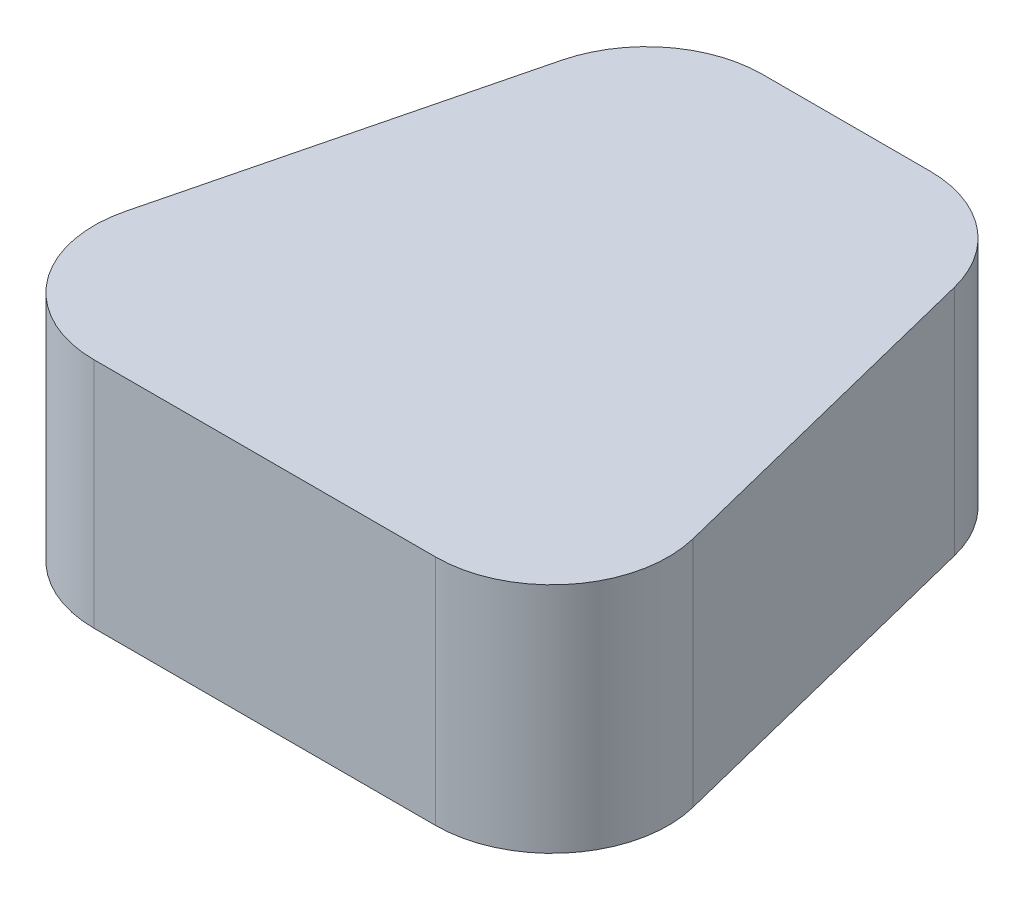
ISO-10303-21;
HEADER;
FILE_DESCRIPTION(('STEP AP214'),'2;1');
FILE_NAME('part.step','',(''),(''),'','','');
FILE_SCHEMA(('AUTOMOTIVE_DESIGN { 1 0 10303 214 1 1 1 1 }'));
ENDSEC;
DATA;
#1=APPLICATION_CONTEXT('core data for automotive mechanical design processes');
#2=APPLICATION_PROTOCOL_DEFINITION('international standard','automotive_design',2000,#1);
#3=PRODUCT_CONTEXT('',#1,'mechanical');
#4=PRODUCT('Part','Part','',(#3));
#5=PRODUCT_RELATED_PRODUCT_CATEGORY('part','',(#4));
#6=PRODUCT_DEFINITION_FORMATION('','',#4);
#7=PRODUCT_DEFINITION_CONTEXT('part definition',#1,'design');
#8=PRODUCT_DEFINITION('design','',#6,#7);
#9=PRODUCT_DEFINITION_SHAPE('','',#8);
#10=(LENGTH_UNIT() NAMED_UNIT(*) SI_UNIT(.MILLI.,.METRE.));
#11=(NAMED_UNIT(*) PLANE_ANGLE_UNIT() SI_UNIT($,.RADIAN.));
#12=(NAMED_UNIT(*) SI_UNIT($,.STERADIAN.) SOLID_ANGLE_UNIT());
#13=UNCERTAINTY_MEASURE_WITH_UNIT(LENGTH_MEASURE(1.E-05),#10,'distance_accuracy_value','');
#14=(GEOMETRIC_REPRESENTATION_CONTEXT(3) GLOBAL_UNCERTAINTY_ASSIGNED_CONTEXT((#13)) GLOBAL_UNIT_ASSIGNED_CONTEXT((#10,
#11,#12)) REPRESENTATION_CONTEXT('',''));
#15=CARTESIAN_POINT('',(0.,0.,0.));
#16=DIRECTION('',(0.,0.,1.));
#17=DIRECTION('',(1.,0.,0.));
#18=AXIS2_PLACEMENT_3D('',#15,#16,#17);
#19=CARTESIAN_POINT('',(0.,1.,0.));
#20=DIRECTION('',(0.,-1.,0.));
#21=DIRECTION('',(0.,0.,-1.));
#22=AXIS2_PLACEMENT_3D('',#19,#20,#21);
#23=PLANE('',#22);
#24=CARTESIAN_POINT('',(-6.84160068989698,0.999999999999994,3.95000000000001));
#25=DIRECTION('',(0.,1.,0.));
#26=DIRECTION('',(0.,0.,1.));
#27=AXIS2_PLACEMENT_3D('',#24,#25,#26);
#28=CIRCLE('',#27,5.);
#29=CARTESIAN_POINT('',(-6.84160068989698,0.999999999999994,8.95000000000001));
#30=VERTEX_POINT('',#29);
#31=EDGE_CURVE('E194',#30,#30,#28,.T.);
#32=ORIENTED_EDGE('',*,*,#31,.T.);
#33=EDGE_LOOP('',(#32));
#34=FACE_BOUND('',#33,.T.);
#35=DIRECTION('',(-0.242535625036333,0.,0.970142500145332));
#36=VECTOR('',#35,1.);
#37=CARTESIAN_POINT('',(-27.4999999999999,0.999999999999994,25.));
#38=LINE('',#37,#36);
#39=CARTESIAN_POINT('',(-16.8936609374091,0.999999999999997,-17.4253562503633));
#40=VERTEX_POINT('',#39);
#41=CARTESIAN_POINT('',(-24.3936609374091,0.999999999999997,12.5746437496367));
#42=VERTEX_POINT('',#41);
#43=EDGE_CURVE('E129',#40,#42,#38,.T.);
#44=ORIENTED_EDGE('',*,*,#43,.F.);
#45=CARTESIAN_POINT('',(-7.1922359359558,1.,-15.));
#46=DIRECTION('',(0.,-1.,0.));
#47=DIRECTION('',(0.,0.,-1.));
#48=AXIS2_PLACEMENT_3D('',#45,#46,#47);
#49=CIRCLE('',#48,10.);
#50=CARTESIAN_POINT('',(-7.19223593595586,1.,-25.));
#51=VERTEX_POINT('',#50);
#52=EDGE_CURVE('E112',#40,#51,#49,.T.);
#53=ORIENTED_EDGE('',*,*,#52,.T.);
#54=DIRECTION('',(-1.,0.,0.));
#55=VECTOR('',#54,1.);
#56=CARTESIAN_POINT('',(-15.,1.,-25.));
#57=LINE('',#56,#55);
#58=CARTESIAN_POINT('',(7.19223593595592,1.,-25.));
#59=VERTEX_POINT('',#58);
#60=EDGE_CURVE('E152',#59,#51,#57,.T.);
#61=ORIENTED_EDGE('',*,*,#60,.F.);
#62=CARTESIAN_POINT('',(7.19223593595586,1.,-15.));
#63=DIRECTION('',(0.,-1.,0.));
#64=DIRECTION('',(0.,0.,-1.));
#65=AXIS2_PLACEMENT_3D('',#62,#63,#64);
#66=CIRCLE('',#65,10.);
#67=CARTESIAN_POINT('',(16.8936609374092,1.,-17.4253562503633));
#68=VERTEX_POINT('',#67);
#69=EDGE_CURVE('E123',#59,#68,#66,.T.);
#70=ORIENTED_EDGE('',*,*,#69,.T.);
#71=DIRECTION('',(-0.242535625036333,0.,-0.970142500145332));
#72=VECTOR('',#71,1.);
#73=CARTESIAN_POINT('',(15.,1.,-25.));
#74=LINE('',#73,#72);
#75=CARTESIAN_POINT('',(24.3936609374092,1.,12.5746437496366));
#76=VERTEX_POINT('',#75);
#77=EDGE_CURVE('E142',#76,#68,#74,.T.);
#78=ORIENTED_EDGE('',*,*,#77,.F.);
#79=CARTESIAN_POINT('',(14.6922359359559,1.,15.));
#80=DIRECTION('',(0.,-1.,0.));
#81=DIRECTION('',(0.,0.,-1.));
#82=AXIS2_PLACEMENT_3D('',#79,#80,#81);
#83=CIRCLE('',#82,10.);
#84=CARTESIAN_POINT('',(14.692235935956,0.999999999999994,25.));
#85=VERTEX_POINT('',#84);
#86=EDGE_CURVE('E156',#76,#85,#83,.T.);
#87=ORIENTED_EDGE('',*,*,#86,.T.);
#88=DIRECTION('',(1.,0.,0.));
#89=VECTOR('',#88,1.);
#90=CARTESIAN_POINT('',(27.5,1.,25.));
#91=LINE('',#90,#89);
#92=CARTESIAN_POINT('',(-14.6922359359558,1.,25.));
#93=VERTEX_POINT('',#92);
#94=EDGE_CURVE('E138',#93,#85,#91,.T.);
#95=ORIENTED_EDGE('',*,*,#94,.F.);
#96=CARTESIAN_POINT('',(-14.6922359359559,0.999999999999994,15.));
#97=DIRECTION('',(0.,-1.,0.));
#98=DIRECTION('',(0.,0.,-1.));
#99=AXIS2_PLACEMENT_3D('',#96,#97,#98);
#100=CIRCLE('',#99,10.);
#101=EDGE_CURVE('E133',#93,#42,#100,.T.);
#102=ORIENTED_EDGE('',*,*,#101,.T.);
#103=EDGE_LOOP('',(#44,#53,#61,#70,#78,#87,#95,#102));
#104=FACE_BOUND('',#103,.T.);
#105=CARTESIAN_POINT('',(6.84160068989709,1.,3.95000000000006));
#106=DIRECTION('',(0.,1.,0.));
#107=DIRECTION('',(0.,0.,1.));
#108=AXIS2_PLACEMENT_3D('',#105,#106,#107);
#109=CIRCLE('',#108,5.);
#110=CARTESIAN_POINT('',(6.84160068989709,1.,8.95000000000006));
#111=VERTEX_POINT('',#110);
#112=EDGE_CURVE('E139',#111,#111,#109,.T.);
#113=ORIENTED_EDGE('',*,*,#112,.T.);
#114=EDGE_LOOP('',(#113));
#115=FACE_BOUND('',#114,.T.);
#116=CARTESIAN_POINT('',(0.,1.,-10.3));
#117=DIRECTION('',(0.,1.,0.));
#118=DIRECTION('',(0.,0.,1.));
#119=AXIS2_PLACEMENT_3D('',#116,#117,#118);
#120=CIRCLE('',#119,5.);
#121=CARTESIAN_POINT('',(0.,1.,-5.29999999999998));
#122=VERTEX_POINT('',#121);
#123=EDGE_CURVE('E200',#122,#122,#120,.T.);
#124=ORIENTED_EDGE('',*,*,#123,.T.);
#125=EDGE_LOOP('',(#124));
#126=FACE_BOUND('',#125,.T.);
#127=ADVANCED_FACE('F46',(#34,#104,#115,#126),#23,.T.);
#128=CARTESIAN_POINT('',(-27.4999999999999,21.,25.));
#129=DIRECTION('',(0.970142500145332,0.,0.242535625036333));
#130=DIRECTION('',(0.242535625036333,0.,-0.970142500145332));
#131=AXIS2_PLACEMENT_3D('',#128,#129,#130);
#132=PLANE('',#131);
#133=DIRECTION('',(-0.242535625036333,0.,0.970142500145332));
#134=VECTOR('',#133,1.);
#135=CARTESIAN_POINT('',(-27.4999999999999,21.,25.));
#136=LINE('',#135,#134);
#137=CARTESIAN_POINT('',(-16.8936609374091,21.,-17.4253562503633));
#138=VERTEX_POINT('',#137);
#139=CARTESIAN_POINT('',(-24.3936609374091,21.,12.5746437496367));
#140=VERTEX_POINT('',#139);
#141=EDGE_CURVE('E132',#138,#140,#136,.T.);
#142=ORIENTED_EDGE('',*,*,#141,.F.);
#143=DIRECTION('',(0.,-1.,0.));
#144=VECTOR('',#143,1.);
#145=CARTESIAN_POINT('',(-16.8936609374091,21.,-17.4253562503633));
#146=LINE('',#145,#144);
#147=EDGE_CURVE('E116',#138,#40,#146,.T.);
#148=ORIENTED_EDGE('',*,*,#147,.T.);
#149=ORIENTED_EDGE('',*,*,#43,.T.);
#150=DIRECTION('',(0.,-1.,0.));
#151=VECTOR('',#150,1.);
#152=CARTESIAN_POINT('',(-24.3936609374091,21.,12.5746437496367));
#153=LINE('',#152,#151);
#154=EDGE_CURVE('E134',#42,#140,#153,.F.);
#155=ORIENTED_EDGE('',*,*,#154,.T.);
#156=EDGE_LOOP('',(#142,#148,#149,#155));
#157=FACE_BOUND('',#156,.T.);
#158=ADVANCED_FACE('F128',(#157),#132,.F.);
#159=CARTESIAN_POINT('',(27.5,21.,25.));
#160=DIRECTION('',(0.,0.,-1.));
#161=DIRECTION('',(-1.,0.,0.));
#162=AXIS2_PLACEMENT_3D('',#159,#160,#161);
#163=PLANE('',#162);
#164=ORIENTED_EDGE('',*,*,#94,.T.);
#165=DIRECTION('',(0.,-1.,0.));
#166=VECTOR('',#165,1.);
#167=CARTESIAN_POINT('',(14.692235935956,21.,25.));
#168=LINE('',#167,#166);
#169=CARTESIAN_POINT('',(14.692235935956,21.,25.));
#170=VERTEX_POINT('',#169);
#171=EDGE_CURVE('E13',#85,#170,#168,.F.);
#172=ORIENTED_EDGE('',*,*,#171,.T.);
#173=DIRECTION('',(1.,0.,0.));
#174=VECTOR('',#173,1.);
#175=CARTESIAN_POINT('',(27.5,21.,25.));
#176=LINE('',#175,#174);
#177=CARTESIAN_POINT('',(-14.6922359359558,21.,25.));
#178=VERTEX_POINT('',#177);
#179=EDGE_CURVE('E178',#178,#170,#176,.T.);
#180=ORIENTED_EDGE('',*,*,#179,.F.);
#181=DIRECTION('',(0.,-1.,0.));
#182=VECTOR('',#181,1.);
#183=CARTESIAN_POINT('',(-14.6922359359558,21.,25.));
#184=LINE('',#183,#182);
#185=EDGE_CURVE('E54',#178,#93,#184,.T.);
#186=ORIENTED_EDGE('',*,*,#185,.T.);
#187=EDGE_LOOP('',(#164,#172,#180,#186));
#188=FACE_BOUND('',#187,.T.);
#189=ADVANCED_FACE('F176',(#188),#163,.F.);
#190=CARTESIAN_POINT('',(15.,21.,-25.));
#191=DIRECTION('',(-0.970142500145331,0.,0.242535625036333));
#192=DIRECTION('',(0.242535625036333,0.,0.970142500145331));
#193=AXIS2_PLACEMENT_3D('',#190,#191,#192);
#194=PLANE('',#193);
#195=ORIENTED_EDGE('',*,*,#77,.T.);
#196=DIRECTION('',(0.,-1.,0.));
#197=VECTOR('',#196,1.);
#198=CARTESIAN_POINT('',(16.8936609374092,21.,-17.4253562503633));
#199=LINE('',#198,#197);
#200=CARTESIAN_POINT('',(16.8936609374092,21.,-17.4253562503633));
#201=VERTEX_POINT('',#200);
#202=EDGE_CURVE('E61',#68,#201,#199,.F.);
#203=ORIENTED_EDGE('',*,*,#202,.T.);
#204=DIRECTION('',(-0.242535625036333,0.,-0.970142500145332));
#205=VECTOR('',#204,1.);
#206=CARTESIAN_POINT('',(15.,21.,-25.));
#207=LINE('',#206,#205);
#208=CARTESIAN_POINT('',(24.3936609374092,21.,12.5746437496367));
#209=VERTEX_POINT('',#208);
#210=EDGE_CURVE('E186',#209,#201,#207,.T.);
#211=ORIENTED_EDGE('',*,*,#210,.F.);
#212=DIRECTION('',(0.,-1.,0.));
#213=VECTOR('',#212,1.);
#214=CARTESIAN_POINT('',(24.3936609374092,21.,12.5746437496367));
#215=LINE('',#214,#213);
#216=EDGE_CURVE('E169',#209,#76,#215,.T.);
#217=ORIENTED_EDGE('',*,*,#216,.T.);
#218=EDGE_LOOP('',(#195,#203,#211,#217));
#219=FACE_BOUND('',#218,.T.);
#220=ADVANCED_FACE('F185',(#219),#194,.F.);
#221=CARTESIAN_POINT('',(-15.,21.,-25.));
#222=DIRECTION('',(0.,0.,1.));
#223=DIRECTION('',(1.,0.,0.));
#224=AXIS2_PLACEMENT_3D('',#221,#222,#223);
#225=PLANE('',#224);
#226=ORIENTED_EDGE('',*,*,#60,.T.);
#227=DIRECTION('',(0.,-1.,0.));
#228=VECTOR('',#227,1.);
#229=CARTESIAN_POINT('',(-7.19223593595586,21.,-25.));
#230=LINE('',#229,#228);
#231=CARTESIAN_POINT('',(-7.19223593595586,21.,-25.));
#232=VERTEX_POINT('',#231);
#233=EDGE_CURVE('E117',#51,#232,#230,.F.);
#234=ORIENTED_EDGE('',*,*,#233,.T.);
#235=DIRECTION('',(-1.,0.,0.));
#236=VECTOR('',#235,1.);
#237=CARTESIAN_POINT('',(-15.,21.,-25.));
#238=LINE('',#237,#236);
#239=CARTESIAN_POINT('',(7.19223593595592,21.,-25.));
#240=VERTEX_POINT('',#239);
#241=EDGE_CURVE('E148',#240,#232,#238,.T.);
#242=ORIENTED_EDGE('',*,*,#241,.F.);
#243=DIRECTION('',(0.,-1.,0.));
#244=VECTOR('',#243,1.);
#245=CARTESIAN_POINT('',(7.19223593595592,21.,-25.));
#246=LINE('',#245,#244);
#247=EDGE_CURVE('E122',#240,#59,#246,.T.);
#248=ORIENTED_EDGE('',*,*,#247,.T.);
#249=EDGE_LOOP('',(#226,#234,#242,#248));
#250=FACE_BOUND('',#249,.T.);
#251=ADVANCED_FACE('F229',(#250),#225,.F.);
#252=CARTESIAN_POINT('',(0.,21.,0.));
#253=DIRECTION('',(0.,-1.,0.));
#254=DIRECTION('',(0.,0.,-1.));
#255=AXIS2_PLACEMENT_3D('',#252,#253,#254);
#256=PLANE('',#255);
#257=ORIENTED_EDGE('',*,*,#241,.T.);
#258=CARTESIAN_POINT('',(-7.1922359359558,21.,-15.));
#259=DIRECTION('',(0.,-1.,0.));
#260=DIRECTION('',(0.,0.,-1.));
#261=AXIS2_PLACEMENT_3D('',#258,#259,#260);
#262=CIRCLE('',#261,10.);
#263=EDGE_CURVE('E167',#232,#138,#262,.F.);
#264=ORIENTED_EDGE('',*,*,#263,.T.);
#265=ORIENTED_EDGE('',*,*,#141,.T.);
#266=CARTESIAN_POINT('',(-14.6922359359559,21.,15.));
#267=DIRECTION('',(0.,-1.,0.));
#268=DIRECTION('',(0.,0.,-1.));
#269=AXIS2_PLACEMENT_3D('',#266,#267,#268);
#270=CIRCLE('',#269,10.);
#271=EDGE_CURVE('E162',#140,#178,#270,.F.);
#272=ORIENTED_EDGE('',*,*,#271,.T.);
#273=ORIENTED_EDGE('',*,*,#179,.T.);
#274=CARTESIAN_POINT('',(14.6922359359559,21.,15.));
#275=DIRECTION('',(0.,-1.,0.));
#276=DIRECTION('',(0.,0.,-1.));
#277=AXIS2_PLACEMENT_3D('',#274,#275,#276);
#278=CIRCLE('',#277,10.);
#279=EDGE_CURVE('E68',#170,#209,#278,.F.);
#280=ORIENTED_EDGE('',*,*,#279,.T.);
#281=ORIENTED_EDGE('',*,*,#210,.T.);
#282=CARTESIAN_POINT('',(7.19223593595586,21.,-15.));
#283=DIRECTION('',(0.,-1.,0.));
#284=DIRECTION('',(0.,0.,-1.));
#285=AXIS2_PLACEMENT_3D('',#282,#283,#284);
#286=CIRCLE('',#285,10.);
#287=EDGE_CURVE('E165',#201,#240,#286,.F.);
#288=ORIENTED_EDGE('',*,*,#287,.T.);
#289=EDGE_LOOP('',(#257,#264,#265,#272,#273,#280,#281,#288));
#290=FACE_BOUND('',#289,.T.);
#291=ADVANCED_FACE('F227',(#290),#256,.F.);
#292=CARTESIAN_POINT('',(-7.1922359359558,21.,-15.));
#293=DIRECTION('',(0.,-1.,0.));
#294=DIRECTION('',(0.,0.,-1.));
#295=AXIS2_PLACEMENT_3D('',#292,#293,#294);
#296=CYLINDRICAL_SURFACE('',#295,10.);
#297=ORIENTED_EDGE('',*,*,#263,.F.);
#298=ORIENTED_EDGE('',*,*,#233,.F.);
#299=ORIENTED_EDGE('',*,*,#52,.F.);
#300=ORIENTED_EDGE('',*,*,#147,.F.);
#301=EDGE_LOOP('',(#297,#298,#299,#300));
#302=FACE_BOUND('',#301,.T.);
#303=ADVANCED_FACE('F115',(#302),#296,.T.);
#304=CARTESIAN_POINT('',(7.19223593595586,21.,-15.));
#305=DIRECTION('',(0.,-1.,0.));
#306=DIRECTION('',(0.,0.,-1.));
#307=AXIS2_PLACEMENT_3D('',#304,#305,#306);
#308=CYLINDRICAL_SURFACE('',#307,10.);
#309=ORIENTED_EDGE('',*,*,#287,.F.);
#310=ORIENTED_EDGE('',*,*,#202,.F.);
#311=ORIENTED_EDGE('',*,*,#69,.F.);
#312=ORIENTED_EDGE('',*,*,#247,.F.);
#313=EDGE_LOOP('',(#309,#310,#311,#312));
#314=FACE_BOUND('',#313,.T.);
#315=ADVANCED_FACE('F239',(#314),#308,.T.);
#316=CARTESIAN_POINT('',(14.6922359359559,21.,15.));
#317=DIRECTION('',(0.,-1.,0.));
#318=DIRECTION('',(0.,0.,-1.));
#319=AXIS2_PLACEMENT_3D('',#316,#317,#318);
#320=CYLINDRICAL_SURFACE('',#319,10.);
#321=ORIENTED_EDGE('',*,*,#279,.F.);
#322=ORIENTED_EDGE('',*,*,#171,.F.);
#323=ORIENTED_EDGE('',*,*,#86,.F.);
#324=ORIENTED_EDGE('',*,*,#216,.F.);
#325=EDGE_LOOP('',(#321,#322,#323,#324));
#326=FACE_BOUND('',#325,.T.);
#327=ADVANCED_FACE('F184',(#326),#320,.T.);
#328=CARTESIAN_POINT('',(-14.6922359359559,21.,15.));
#329=DIRECTION('',(0.,-1.,0.));
#330=DIRECTION('',(0.,0.,-1.));
#331=AXIS2_PLACEMENT_3D('',#328,#329,#330);
#332=CYLINDRICAL_SURFACE('',#331,10.);
#333=ORIENTED_EDGE('',*,*,#271,.F.);
#334=ORIENTED_EDGE('',*,*,#154,.F.);
#335=ORIENTED_EDGE('',*,*,#101,.F.);
#336=ORIENTED_EDGE('',*,*,#185,.F.);
#337=EDGE_LOOP('',(#333,#334,#335,#336));
#338=FACE_BOUND('',#337,.T.);
#339=ADVANCED_FACE('F48',(#338),#332,.T.);
#340=CARTESIAN_POINT('',(6.84160068989709,15.142135623731,3.95000000000006));
#341=DIRECTION('',(0.,-1.,0.));
#342=DIRECTION('',(0.,0.,-1.));
#343=AXIS2_PLACEMENT_3D('',#340,#341,#342);
#344=CYLINDRICAL_SURFACE('',#343,5.);
#345=CARTESIAN_POINT('',(6.84160068989709,0.,3.95000000000006));
#346=DIRECTION('',(0.,1.,0.));
#347=DIRECTION('',(0.,0.,1.));
#348=AXIS2_PLACEMENT_3D('',#345,#346,#347);
#349=CIRCLE('',#348,5.);
#350=CARTESIAN_POINT('',(6.84160068989709,0.,8.95000000000006));
#351=VERTEX_POINT('',#350);
#352=EDGE_CURVE('E145',#351,#351,#349,.T.);
#353=ORIENTED_EDGE('',*,*,#352,.T.);
#354=EDGE_LOOP('',(#353));
#355=FACE_BOUND('',#354,.T.);
#356=ORIENTED_EDGE('',*,*,#112,.F.);
#357=EDGE_LOOP('',(#356));
#358=FACE_BOUND('',#357,.T.);
#359=ADVANCED_FACE('F246',(#355,#358),#344,.T.);
#360=CARTESIAN_POINT('',(6.84160068989709,0.,3.95000000000006));
#361=DIRECTION('',(0.,1.,0.));
#362=DIRECTION('',(0.,0.,1.));
#363=AXIS2_PLACEMENT_3D('',#360,#361,#362);
#364=PLANE('',#363);
#365=ORIENTED_EDGE('',*,*,#352,.F.);
#366=EDGE_LOOP('',(#365));
#367=FACE_BOUND('',#366,.T.);
#368=ADVANCED_FACE('F250',(#367),#364,.F.);
#369=CARTESIAN_POINT('',(-6.84160068989698,15.1421356237309,3.95000000000001));
#370=DIRECTION('',(0.,-1.,0.));
#371=DIRECTION('',(0.,0.,-1.));
#372=AXIS2_PLACEMENT_3D('',#369,#370,#371);
#373=CYLINDRICAL_SURFACE('',#372,5.);
#374=CARTESIAN_POINT('',(-6.84160068989698,0.,3.95000000000001));
#375=DIRECTION('',(0.,1.,0.));
#376=DIRECTION('',(0.,0.,1.));
#377=AXIS2_PLACEMENT_3D('',#374,#375,#376);
#378=CIRCLE('',#377,5.);
#379=CARTESIAN_POINT('',(-6.84160068989698,0.,8.95000000000001));
#380=VERTEX_POINT('',#379);
#381=EDGE_CURVE('E197',#380,#380,#378,.T.);
#382=ORIENTED_EDGE('',*,*,#381,.T.);
#383=EDGE_LOOP('',(#382));
#384=FACE_BOUND('',#383,.T.);
#385=ORIENTED_EDGE('',*,*,#31,.F.);
#386=EDGE_LOOP('',(#385));
#387=FACE_BOUND('',#386,.T.);
#388=ADVANCED_FACE('F290',(#384,#387),#373,.T.);
#389=CARTESIAN_POINT('',(-6.84160068989698,0.,3.95000000000001));
#390=DIRECTION('',(0.,1.,0.));
#391=DIRECTION('',(0.,0.,1.));
#392=AXIS2_PLACEMENT_3D('',#389,#390,#391);
#393=PLANE('',#392);
#394=ORIENTED_EDGE('',*,*,#381,.F.);
#395=EDGE_LOOP('',(#394));
#396=FACE_BOUND('',#395,.T.);
#397=ADVANCED_FACE('F216',(#396),#393,.F.);
#398=CARTESIAN_POINT('',(0.,15.1421356237309,-10.3));
#399=DIRECTION('',(0.,-1.,0.));
#400=DIRECTION('',(0.,0.,-1.));
#401=AXIS2_PLACEMENT_3D('',#398,#399,#400);
#402=CYLINDRICAL_SURFACE('',#401,5.);
#403=CARTESIAN_POINT('',(0.,0.,-10.3));
#404=DIRECTION('',(0.,1.,0.));
#405=DIRECTION('',(0.,0.,1.));
#406=AXIS2_PLACEMENT_3D('',#403,#404,#405);
#407=CIRCLE('',#406,5.);
#408=CARTESIAN_POINT('',(0.,0.,-5.29999999999998));
#409=VERTEX_POINT('',#408);
#410=EDGE_CURVE('E203',#409,#409,#407,.T.);
#411=ORIENTED_EDGE('',*,*,#410,.T.);
#412=EDGE_LOOP('',(#411));
#413=FACE_BOUND('',#412,.T.);
#414=ORIENTED_EDGE('',*,*,#123,.F.);
#415=EDGE_LOOP('',(#414));
#416=FACE_BOUND('',#415,.T.);
#417=ADVANCED_FACE('F207',(#413,#416),#402,.T.);
#418=CARTESIAN_POINT('',(0.,0.,-10.3));
#419=DIRECTION('',(0.,1.,0.));
#420=DIRECTION('',(0.,0.,1.));
#421=AXIS2_PLACEMENT_3D('',#418,#419,#420);
#422=PLANE('',#421);
#423=ORIENTED_EDGE('',*,*,#410,.F.);
#424=EDGE_LOOP('',(#423));
#425=FACE_BOUND('',#424,.T.);
#426=ADVANCED_FACE('F210',(#425),#422,.F.);
#427=CLOSED_SHELL('',(#127,#158,#189,#220,#251,#291,#303,#315,#327,#339,#359,#368,#388,#397,
#417,#426));
#428=MANIFOLD_SOLID_BREP('B2',#427);
#429=ADVANCED_BREP_SHAPE_REPRESENTATION('',(#18,#428),#14);
#430=SHAPE_DEFINITION_REPRESENTATION(#9,#429);
ENDSEC;
END-ISO-10303-21;
